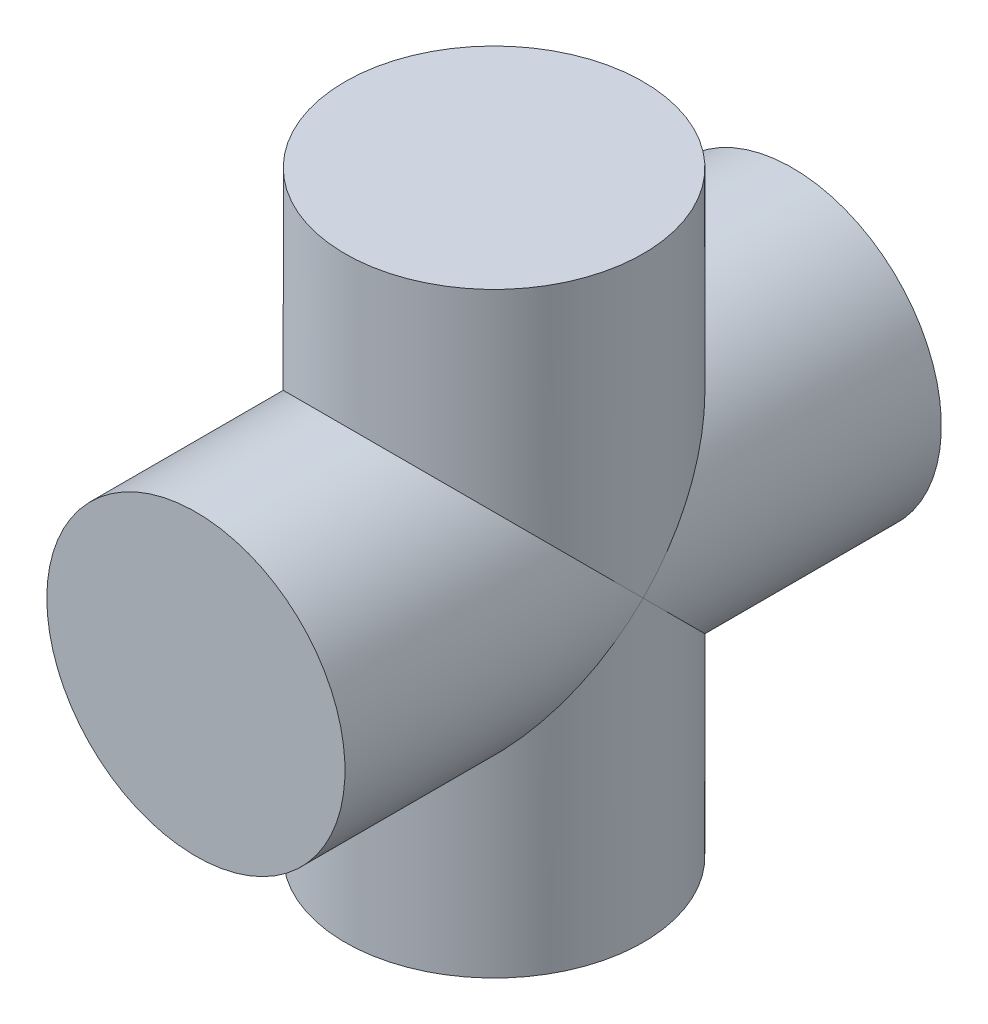
ISO-10303-21;
HEADER;
FILE_DESCRIPTION(('STEP AP214'),'2;1');
FILE_NAME('part.step','',(''),(''),'','','');
FILE_SCHEMA(('AUTOMOTIVE_DESIGN { 1 0 10303 214 1 1 1 1 }'));
ENDSEC;
DATA;
#1=APPLICATION_CONTEXT('core data for automotive mechanical design processes');
#2=APPLICATION_PROTOCOL_DEFINITION('international standard','automotive_design',2000,#1);
#3=PRODUCT_CONTEXT('',#1,'mechanical');
#4=PRODUCT('Part','Part','',(#3));
#5=PRODUCT_RELATED_PRODUCT_CATEGORY('part','',(#4));
#6=PRODUCT_DEFINITION_FORMATION('','',#4);
#7=PRODUCT_DEFINITION_CONTEXT('part definition',#1,'design');
#8=PRODUCT_DEFINITION('design','',#6,#7);
#9=PRODUCT_DEFINITION_SHAPE('','',#8);
#10=(LENGTH_UNIT() NAMED_UNIT(*) SI_UNIT(.MILLI.,.METRE.));
#11=(NAMED_UNIT(*) PLANE_ANGLE_UNIT() SI_UNIT($,.RADIAN.));
#12=(NAMED_UNIT(*) SI_UNIT($,.STERADIAN.) SOLID_ANGLE_UNIT());
#13=UNCERTAINTY_MEASURE_WITH_UNIT(LENGTH_MEASURE(1.E-05),#10,'distance_accuracy_value','');
#14=(GEOMETRIC_REPRESENTATION_CONTEXT(3) GLOBAL_UNCERTAINTY_ASSIGNED_CONTEXT((#13)) GLOBAL_UNIT_ASSIGNED_CONTEXT((#10,
#11,#12)) REPRESENTATION_CONTEXT('',''));
#15=CARTESIAN_POINT('',(0.,0.,0.));
#16=DIRECTION('',(0.,0.,1.));
#17=DIRECTION('',(1.,0.,0.));
#18=AXIS2_PLACEMENT_3D('',#15,#16,#17);
#19=CARTESIAN_POINT('',(0.,-20.,0.));
#20=DIRECTION('',(0.,-1.,0.));
#21=DIRECTION('',(1.,0.,0.));
#22=AXIS2_PLACEMENT_3D('',#19,#20,#21);
#23=PLANE('',#22);
#24=CARTESIAN_POINT('',(0.,-20.,0.));
#25=DIRECTION('',(0.,1.,0.));
#26=DIRECTION('',(-1.,0.,0.));
#27=AXIS2_PLACEMENT_3D('',#24,#25,#26);
#28=CIRCLE('',#27,10.);
#29=CARTESIAN_POINT('',(-9.99999999999999,-20.,0.));
#30=VERTEX_POINT('',#29);
#31=EDGE_CURVE('E61',#30,#30,#28,.T.);
#32=ORIENTED_EDGE('',*,*,#31,.F.);
#33=EDGE_LOOP('',(#32));
#34=FACE_BOUND('',#33,.T.);
#35=ADVANCED_FACE('F34',(#34),#23,.T.);
#36=CARTESIAN_POINT('',(0.,20.,0.));
#37=DIRECTION('',(0.,1.,0.));
#38=DIRECTION('',(-1.,0.,0.));
#39=AXIS2_PLACEMENT_3D('',#36,#37,#38);
#40=CYLINDRICAL_SURFACE('',#39,10.);
#41=CARTESIAN_POINT('',(0.,0.,0.));
#42=DIRECTION('',(0.,0.707106781186547,-0.707106781186547));
#43=DIRECTION('',(0.,0.707106781186547,0.707106781186547));
#44=AXIS2_PLACEMENT_3D('',#41,#42,#43);
#45=ELLIPSE('',#44,14.1421356237309,10.);
#46=CARTESIAN_POINT('',(10.,0.,0.));
#47=VERTEX_POINT('',#46);
#48=CARTESIAN_POINT('',(-10.,0.,0.));
#49=VERTEX_POINT('',#48);
#50=EDGE_CURVE('E41',#47,#49,#45,.T.);
#51=ORIENTED_EDGE('',*,*,#50,.F.);
#52=CARTESIAN_POINT('',(0.,0.,0.));
#53=DIRECTION('',(0.,0.707106781186547,0.707106781186547));
#54=DIRECTION('',(0.,0.707106781186547,-0.707106781186547));
#55=AXIS2_PLACEMENT_3D('',#52,#53,#54);
#56=ELLIPSE('',#55,14.1421356237309,10.);
#57=EDGE_CURVE('E53',#49,#47,#56,.T.);
#58=ORIENTED_EDGE('',*,*,#57,.F.);
#59=EDGE_LOOP('',(#51,#58));
#60=FACE_BOUND('',#59,.T.);
#61=ORIENTED_EDGE('',*,*,#31,.T.);
#62=EDGE_LOOP('',(#61));
#63=FACE_BOUND('',#62,.T.);
#64=ADVANCED_FACE('F54',(#60,#63),#40,.T.);
#65=CARTESIAN_POINT('',(-10.,0.,-20.));
#66=DIRECTION('',(0.,0.,-1.));
#67=DIRECTION('',(-1.,0.,0.));
#68=AXIS2_PLACEMENT_3D('',#65,#66,#67);
#69=PLANE('',#68);
#70=CARTESIAN_POINT('',(0.,0.,-20.));
#71=DIRECTION('',(0.,0.,-1.));
#72=DIRECTION('',(-1.,0.,0.));
#73=AXIS2_PLACEMENT_3D('',#70,#71,#72);
#74=CIRCLE('',#73,10.);
#75=CARTESIAN_POINT('',(-10.,0.,-20.));
#76=VERTEX_POINT('',#75);
#77=EDGE_CURVE('E74',#76,#76,#74,.T.);
#78=ORIENTED_EDGE('',*,*,#77,.T.);
#79=EDGE_LOOP('',(#78));
#80=FACE_BOUND('',#79,.T.);
#81=ADVANCED_FACE('F88',(#80),#69,.T.);
#82=CARTESIAN_POINT('',(0.,0.,-20.));
#83=DIRECTION('',(0.,0.,-1.));
#84=DIRECTION('',(-1.,0.,0.));
#85=AXIS2_PLACEMENT_3D('',#82,#83,#84);
#86=CYLINDRICAL_SURFACE('',#85,10.);
#87=ORIENTED_EDGE('',*,*,#77,.F.);
#88=EDGE_LOOP('',(#87));
#89=FACE_BOUND('',#88,.T.);
#90=CARTESIAN_POINT('',(0.,0.,0.));
#91=DIRECTION('',(0.,0.707106781186547,0.707106781186547));
#92=DIRECTION('',(0.,0.707106781186547,-0.707106781186547));
#93=AXIS2_PLACEMENT_3D('',#90,#91,#92);
#94=ELLIPSE('',#93,14.1421356237309,10.);
#95=EDGE_CURVE('E47',#49,#47,#94,.F.);
#96=ORIENTED_EDGE('',*,*,#95,.T.);
#97=ORIENTED_EDGE('',*,*,#50,.T.);
#98=EDGE_LOOP('',(#96,#97));
#99=FACE_BOUND('',#98,.T.);
#100=ADVANCED_FACE('F63',(#89,#99),#86,.T.);
#101=CARTESIAN_POINT('',(0.,20.,0.));
#102=DIRECTION('',(0.,1.,0.));
#103=DIRECTION('',(-1.,0.,0.));
#104=AXIS2_PLACEMENT_3D('',#101,#102,#103);
#105=PLANE('',#104);
#106=CARTESIAN_POINT('',(0.,20.,0.));
#107=DIRECTION('',(0.,1.,0.));
#108=DIRECTION('',(-1.,0.,0.));
#109=AXIS2_PLACEMENT_3D('',#106,#107,#108);
#110=CIRCLE('',#109,10.);
#111=CARTESIAN_POINT('',(-10.,20.,0.));
#112=VERTEX_POINT('',#111);
#113=EDGE_CURVE('E73',#112,#112,#110,.T.);
#114=ORIENTED_EDGE('',*,*,#113,.T.);
#115=EDGE_LOOP('',(#114));
#116=FACE_BOUND('',#115,.T.);
#117=ADVANCED_FACE('F96',(#116),#105,.T.);
#118=CARTESIAN_POINT('',(0.,0.,0.));
#119=DIRECTION('',(0.,0.707106781186547,-0.707106781186547));
#120=DIRECTION('',(0.,0.707106781186547,0.707106781186547));
#121=AXIS2_PLACEMENT_3D('',#118,#119,#120);
#122=ELLIPSE('',#121,14.1421356237309,10.);
#123=EDGE_CURVE('E11',#47,#49,#122,.F.);
#124=ORIENTED_EDGE('',*,*,#123,.F.);
#125=ORIENTED_EDGE('',*,*,#95,.F.);
#126=EDGE_LOOP('',(#124,#125));
#127=FACE_BOUND('',#126,.T.);
#128=ORIENTED_EDGE('',*,*,#113,.F.);
#129=EDGE_LOOP('',(#128));
#130=FACE_BOUND('',#129,.T.);
#131=ADVANCED_FACE('F59',(#127,#130),#40,.T.);
#132=ORIENTED_EDGE('',*,*,#57,.T.);
#133=ORIENTED_EDGE('',*,*,#123,.T.);
#134=EDGE_LOOP('',(#132,#133));
#135=FACE_BOUND('',#134,.T.);
#136=CARTESIAN_POINT('',(0.,0.,20.));
#137=DIRECTION('',(0.,0.,-1.));
#138=DIRECTION('',(-1.,0.,0.));
#139=AXIS2_PLACEMENT_3D('',#136,#137,#138);
#140=CIRCLE('',#139,10.);
#141=CARTESIAN_POINT('',(-10.,0.,20.));
#142=VERTEX_POINT('',#141);
#143=EDGE_CURVE('E71',#142,#142,#140,.T.);
#144=ORIENTED_EDGE('',*,*,#143,.T.);
#145=EDGE_LOOP('',(#144));
#146=FACE_BOUND('',#145,.T.);
#147=ADVANCED_FACE('F64',(#135,#146),#86,.T.);
#148=CARTESIAN_POINT('',(-10.,0.,20.));
#149=DIRECTION('',(0.,0.,1.));
#150=DIRECTION('',(1.,0.,0.));
#151=AXIS2_PLACEMENT_3D('',#148,#149,#150);
#152=PLANE('',#151);
#153=ORIENTED_EDGE('',*,*,#143,.F.);
#154=EDGE_LOOP('',(#153));
#155=FACE_BOUND('',#154,.T.);
#156=ADVANCED_FACE('F67',(#155),#152,.T.);
#157=CLOSED_SHELL('',(#35,#64,#81,#100,#117,#131,#147,#156));
#158=MANIFOLD_SOLID_BREP('B2',#157);
#159=ADVANCED_BREP_SHAPE_REPRESENTATION('',(#18,#158),#14);
#160=SHAPE_DEFINITION_REPRESENTATION(#9,#159);
ENDSEC;
END-ISO-10303-21;
